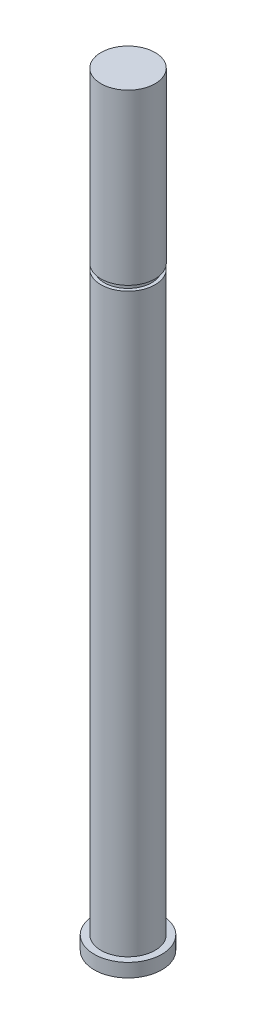
ISO-10303-21;
HEADER;
FILE_DESCRIPTION(('STEP AP214'),'2;1');
FILE_NAME('part.step','',(''),(''),'','','');
FILE_SCHEMA(('AUTOMOTIVE_DESIGN { 1 0 10303 214 1 1 1 1 }'));
ENDSEC;
DATA;
#1=APPLICATION_CONTEXT('core data for automotive mechanical design processes');
#2=APPLICATION_PROTOCOL_DEFINITION('international standard','automotive_design',2000,#1);
#3=PRODUCT_CONTEXT('',#1,'mechanical');
#4=PRODUCT('Part','Part','',(#3));
#5=PRODUCT_RELATED_PRODUCT_CATEGORY('part','',(#4));
#6=PRODUCT_DEFINITION_FORMATION('','',#4);
#7=PRODUCT_DEFINITION_CONTEXT('part definition',#1,'design');
#8=PRODUCT_DEFINITION('design','',#6,#7);
#9=PRODUCT_DEFINITION_SHAPE('','',#8);
#10=(LENGTH_UNIT() NAMED_UNIT(*) SI_UNIT(.MILLI.,.METRE.));
#11=(NAMED_UNIT(*) PLANE_ANGLE_UNIT() SI_UNIT($,.RADIAN.));
#12=(NAMED_UNIT(*) SI_UNIT($,.STERADIAN.) SOLID_ANGLE_UNIT());
#13=UNCERTAINTY_MEASURE_WITH_UNIT(LENGTH_MEASURE(1.E-05),#10,'distance_accuracy_value','');
#14=(GEOMETRIC_REPRESENTATION_CONTEXT(3) GLOBAL_UNCERTAINTY_ASSIGNED_CONTEXT((#13)) GLOBAL_UNIT_ASSIGNED_CONTEXT((#10,
#11,#12)) REPRESENTATION_CONTEXT('',''));
#15=CARTESIAN_POINT('',(0.,0.,0.));
#16=DIRECTION('',(0.,0.,1.));
#17=DIRECTION('',(1.,0.,0.));
#18=AXIS2_PLACEMENT_3D('',#15,#16,#17);
#19=CARTESIAN_POINT('',(0.,113.,0.));
#20=DIRECTION('',(0.,-1.,0.));
#21=DIRECTION('',(0.,0.,-1.));
#22=AXIS2_PLACEMENT_3D('',#19,#20,#21);
#23=CYLINDRICAL_SURFACE('',#22,4.);
#24=CARTESIAN_POINT('',(0.,87.25,0.));
#25=DIRECTION('',(0.,1.,0.));
#26=DIRECTION('',(0.,0.,1.));
#27=AXIS2_PLACEMENT_3D('',#24,#25,#26);
#28=CIRCLE('',#27,4.);
#29=CARTESIAN_POINT('',(0.,87.25,4.));
#30=VERTEX_POINT('',#29);
#31=EDGE_CURVE('E42',#30,#30,#28,.T.);
#32=ORIENTED_EDGE('',*,*,#31,.F.);
#33=EDGE_LOOP('',(#32));
#34=FACE_BOUND('',#33,.T.);
#35=CARTESIAN_POINT('',(0.,2.,0.));
#36=DIRECTION('',(0.,-1.,0.));
#37=DIRECTION('',(0.,0.,-1.));
#38=AXIS2_PLACEMENT_3D('',#35,#36,#37);
#39=CIRCLE('',#38,4.);
#40=CARTESIAN_POINT('',(0.,2.,-4.));
#41=VERTEX_POINT('',#40);
#42=EDGE_CURVE('E10',#41,#41,#39,.T.);
#43=ORIENTED_EDGE('',*,*,#42,.F.);
#44=EDGE_LOOP('',(#43));
#45=FACE_BOUND('',#44,.T.);
#46=ADVANCED_FACE('F31',(#34,#45),#23,.T.);
#47=CARTESIAN_POINT('',(0.,87.25,0.));
#48=DIRECTION('',(0.,1.,0.));
#49=DIRECTION('',(0.,0.,1.));
#50=AXIS2_PLACEMENT_3D('',#47,#48,#49);
#51=CYLINDRICAL_SURFACE('',#50,3.5);
#52=CARTESIAN_POINT('',(0.,87.25,0.));
#53=DIRECTION('',(0.,1.,0.));
#54=DIRECTION('',(0.,0.,1.));
#55=AXIS2_PLACEMENT_3D('',#52,#53,#54);
#56=CIRCLE('',#55,3.5);
#57=CARTESIAN_POINT('',(0.,87.25,3.5));
#58=VERTEX_POINT('',#57);
#59=EDGE_CURVE('E46',#58,#58,#56,.T.);
#60=ORIENTED_EDGE('',*,*,#59,.T.);
#61=EDGE_LOOP('',(#60));
#62=FACE_BOUND('',#61,.T.);
#63=CARTESIAN_POINT('',(0.,88.,0.));
#64=DIRECTION('',(0.,1.,0.));
#65=DIRECTION('',(0.,0.,1.));
#66=AXIS2_PLACEMENT_3D('',#63,#64,#65);
#67=CIRCLE('',#66,3.5);
#68=CARTESIAN_POINT('',(0.,88.,3.5));
#69=VERTEX_POINT('',#68);
#70=EDGE_CURVE('E52',#69,#69,#67,.T.);
#71=ORIENTED_EDGE('',*,*,#70,.F.);
#72=EDGE_LOOP('',(#71));
#73=FACE_BOUND('',#72,.T.);
#74=ADVANCED_FACE('F78',(#62,#73),#51,.T.);
#75=CARTESIAN_POINT('',(0.,87.25,0.));
#76=DIRECTION('',(0.,1.,0.));
#77=DIRECTION('',(0.,0.,1.));
#78=AXIS2_PLACEMENT_3D('',#75,#76,#77);
#79=PLANE('',#78);
#80=ORIENTED_EDGE('',*,*,#59,.F.);
#81=EDGE_LOOP('',(#80));
#82=FACE_BOUND('',#81,.T.);
#83=ORIENTED_EDGE('',*,*,#31,.T.);
#84=EDGE_LOOP('',(#83));
#85=FACE_BOUND('',#84,.T.);
#86=ADVANCED_FACE('F83',(#82,#85),#79,.T.);
#87=CARTESIAN_POINT('',(0.,88.,0.));
#88=DIRECTION('',(0.,1.,0.));
#89=DIRECTION('',(0.,0.,1.));
#90=AXIS2_PLACEMENT_3D('',#87,#88,#89);
#91=PLANE('',#90);
#92=ORIENTED_EDGE('',*,*,#70,.T.);
#93=EDGE_LOOP('',(#92));
#94=FACE_BOUND('',#93,.T.);
#95=CARTESIAN_POINT('',(0.,88.,0.));
#96=DIRECTION('',(0.,1.,0.));
#97=DIRECTION('',(0.,0.,1.));
#98=AXIS2_PLACEMENT_3D('',#95,#96,#97);
#99=CIRCLE('',#98,4.);
#100=CARTESIAN_POINT('',(0.,88.,4.));
#101=VERTEX_POINT('',#100);
#102=EDGE_CURVE('E49',#101,#101,#99,.T.);
#103=ORIENTED_EDGE('',*,*,#102,.F.);
#104=EDGE_LOOP('',(#103));
#105=FACE_BOUND('',#104,.T.);
#106=ADVANCED_FACE('F94',(#94,#105),#91,.F.);
#107=CARTESIAN_POINT('',(0.,113.,0.));
#108=DIRECTION('',(0.,1.,0.));
#109=DIRECTION('',(0.,0.,1.));
#110=AXIS2_PLACEMENT_3D('',#107,#108,#109);
#111=PLANE('',#110);
#112=CARTESIAN_POINT('',(0.,113.,0.));
#113=DIRECTION('',(0.,1.,0.));
#114=DIRECTION('',(0.,0.,1.));
#115=AXIS2_PLACEMENT_3D('',#112,#113,#114);
#116=CIRCLE('',#115,4.);
#117=CARTESIAN_POINT('',(0.,113.,4.));
#118=VERTEX_POINT('',#117);
#119=EDGE_CURVE('E38',#118,#118,#116,.T.);
#120=ORIENTED_EDGE('',*,*,#119,.T.);
#121=EDGE_LOOP('',(#120));
#122=FACE_BOUND('',#121,.T.);
#123=ADVANCED_FACE('F89',(#122),#111,.T.);
#124=ORIENTED_EDGE('',*,*,#102,.T.);
#125=EDGE_LOOP('',(#124));
#126=FACE_BOUND('',#125,.T.);
#127=ORIENTED_EDGE('',*,*,#119,.F.);
#128=EDGE_LOOP('',(#127));
#129=FACE_BOUND('',#128,.T.);
#130=ADVANCED_FACE('F33',(#126,#129),#23,.T.);
#131=CARTESIAN_POINT('',(0.,2.,0.));
#132=DIRECTION('',(0.,-1.,0.));
#133=DIRECTION('',(0.,0.,-1.));
#134=AXIS2_PLACEMENT_3D('',#131,#132,#133);
#135=CYLINDRICAL_SURFACE('',#134,5.);
#136=CARTESIAN_POINT('',(0.,2.,0.));
#137=DIRECTION('',(0.,-1.,0.));
#138=DIRECTION('',(0.,0.,-1.));
#139=AXIS2_PLACEMENT_3D('',#136,#137,#138);
#140=CIRCLE('',#139,5.);
#141=CARTESIAN_POINT('',(0.,2.,-5.));
#142=VERTEX_POINT('',#141);
#143=EDGE_CURVE('E54',#142,#142,#140,.T.);
#144=ORIENTED_EDGE('',*,*,#143,.T.);
#145=EDGE_LOOP('',(#144));
#146=FACE_BOUND('',#145,.T.);
#147=CARTESIAN_POINT('',(0.,0.,0.));
#148=DIRECTION('',(0.,-1.,0.));
#149=DIRECTION('',(0.,0.,-1.));
#150=AXIS2_PLACEMENT_3D('',#147,#148,#149);
#151=CIRCLE('',#150,5.);
#152=CARTESIAN_POINT('',(0.,0.,-5.));
#153=VERTEX_POINT('',#152);
#154=EDGE_CURVE('E58',#153,#153,#151,.T.);
#155=ORIENTED_EDGE('',*,*,#154,.F.);
#156=EDGE_LOOP('',(#155));
#157=FACE_BOUND('',#156,.T.);
#158=ADVANCED_FACE('F64',(#146,#157),#135,.T.);
#159=CARTESIAN_POINT('',(0.,2.,0.));
#160=DIRECTION('',(0.,-1.,0.));
#161=DIRECTION('',(0.,0.,-1.));
#162=AXIS2_PLACEMENT_3D('',#159,#160,#161);
#163=PLANE('',#162);
#164=ORIENTED_EDGE('',*,*,#42,.T.);
#165=EDGE_LOOP('',(#164));
#166=FACE_BOUND('',#165,.T.);
#167=ORIENTED_EDGE('',*,*,#143,.F.);
#168=EDGE_LOOP('',(#167));
#169=FACE_BOUND('',#168,.T.);
#170=ADVANCED_FACE('F67',(#166,#169),#163,.F.);
#171=CARTESIAN_POINT('',(0.,0.,0.));
#172=DIRECTION('',(0.,1.,0.));
#173=DIRECTION('',(0.,0.,1.));
#174=AXIS2_PLACEMENT_3D('',#171,#172,#173);
#175=PLANE('',#174);
#176=ORIENTED_EDGE('',*,*,#154,.T.);
#177=EDGE_LOOP('',(#176));
#178=FACE_BOUND('',#177,.T.);
#179=ADVANCED_FACE('F69',(#178),#175,.F.);
#180=CLOSED_SHELL('',(#46,#74,#86,#106,#123,#130,#158,#170,#179));
#181=MANIFOLD_SOLID_BREP('B2',#180);
#182=ADVANCED_BREP_SHAPE_REPRESENTATION('',(#18,#181),#14);
#183=SHAPE_DEFINITION_REPRESENTATION(#9,#182);
ENDSEC;
END-ISO-10303-21;
